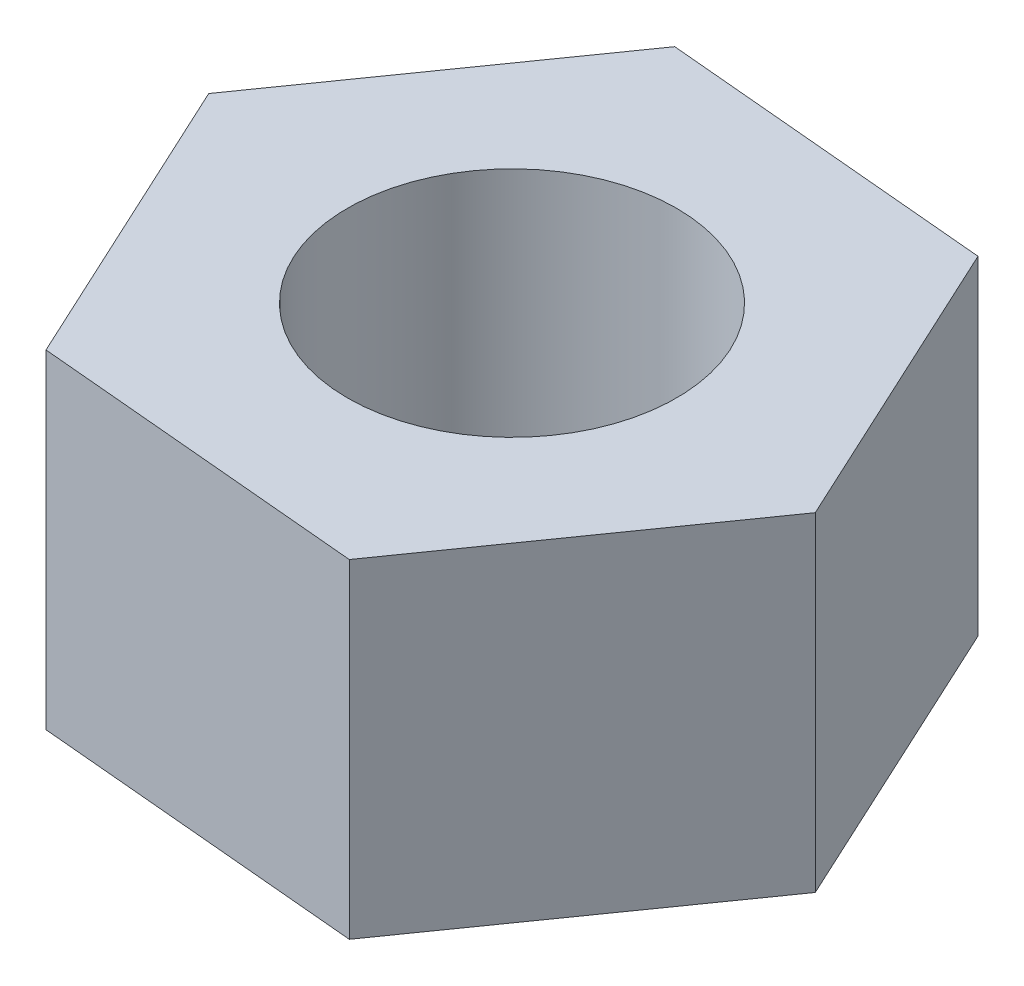
ISO-10303-21;
HEADER;
FILE_DESCRIPTION(('STEP AP214'),'2;1');
FILE_NAME('part.step','',(''),(''),'','','');
FILE_SCHEMA(('AUTOMOTIVE_DESIGN { 1 0 10303 214 1 1 1 1 }'));
ENDSEC;
DATA;
#1=APPLICATION_CONTEXT('core data for automotive mechanical design processes');
#2=APPLICATION_PROTOCOL_DEFINITION('international standard','automotive_design',2000,#1);
#3=PRODUCT_CONTEXT('',#1,'mechanical');
#4=PRODUCT('Part','Part','',(#3));
#5=PRODUCT_RELATED_PRODUCT_CATEGORY('part','',(#4));
#6=PRODUCT_DEFINITION_FORMATION('','',#4);
#7=PRODUCT_DEFINITION_CONTEXT('part definition',#1,'design');
#8=PRODUCT_DEFINITION('design','',#6,#7);
#9=PRODUCT_DEFINITION_SHAPE('','',#8);
#10=(LENGTH_UNIT() NAMED_UNIT(*) SI_UNIT(.MILLI.,.METRE.));
#11=(NAMED_UNIT(*) PLANE_ANGLE_UNIT() SI_UNIT($,.RADIAN.));
#12=(NAMED_UNIT(*) SI_UNIT($,.STERADIAN.) SOLID_ANGLE_UNIT());
#13=UNCERTAINTY_MEASURE_WITH_UNIT(LENGTH_MEASURE(1.E-05),#10,'distance_accuracy_value','');
#14=(GEOMETRIC_REPRESENTATION_CONTEXT(3) GLOBAL_UNCERTAINTY_ASSIGNED_CONTEXT((#13)) GLOBAL_UNIT_ASSIGNED_CONTEXT((#10,
#11,#12)) REPRESENTATION_CONTEXT('',''));
#15=CARTESIAN_POINT('',(0.,0.,0.));
#16=DIRECTION('',(0.,0.,1.));
#17=DIRECTION('',(1.,0.,0.));
#18=AXIS2_PLACEMENT_3D('',#15,#16,#17);
#19=CARTESIAN_POINT('',(0.,4.,0.));
#20=DIRECTION('',(0.,1.,0.));
#21=DIRECTION('',(0.,0.,1.));
#22=AXIS2_PLACEMENT_3D('',#19,#20,#21);
#23=PLANE('',#22);
#24=DIRECTION('',(0.996003754534977,0.,0.0893113707891086));
#25=VECTOR('',#24,1.);
#26=CARTESIAN_POINT('',(-2.34018535864999,4.,3.32678491316549));
#27=LINE('',#26,#25);
#28=CARTESIAN_POINT('',(-2.34018535864999,4.,3.32678491316549));
#29=VERTEX_POINT('',#28);
#30=CARTESIAN_POINT('',(1.71098756840313,4.,3.69005242673803));
#31=VERTEX_POINT('',#30);
#32=EDGE_CURVE('E150',#29,#31,#27,.T.);
#33=ORIENTED_EDGE('',*,*,#32,.T.);
#34=DIRECTION('',(0.575347793217667,0.,-0.817908868297416));
#35=VECTOR('',#34,1.);
#36=CARTESIAN_POINT('',(1.71098756840313,4.,3.69005242673803));
#37=LINE('',#36,#35);
#38=CARTESIAN_POINT('',(4.05117292705312,4.,0.363267513572542));
#39=VERTEX_POINT('',#38);
#40=EDGE_CURVE('E98',#31,#39,#37,.T.);
#41=ORIENTED_EDGE('',*,*,#40,.T.);
#42=DIRECTION('',(-0.420655961317309,0.,-0.907220239086524));
#43=VECTOR('',#42,1.);
#44=CARTESIAN_POINT('',(4.05117292705312,4.,0.363267513572542));
#45=LINE('',#44,#43);
#46=CARTESIAN_POINT('',(2.34018535864999,4.,-3.32678491316549));
#47=VERTEX_POINT('',#46);
#48=EDGE_CURVE('E111',#39,#47,#45,.T.);
#49=ORIENTED_EDGE('',*,*,#48,.T.);
#50=DIRECTION('',(-0.996003754534977,0.,-0.0893113707891089));
#51=VECTOR('',#50,1.);
#52=CARTESIAN_POINT('',(2.34018535864999,4.,-3.32678491316549));
#53=LINE('',#52,#51);
#54=CARTESIAN_POINT('',(-1.71098756840313,4.,-3.69005242673804));
#55=VERTEX_POINT('',#54);
#56=EDGE_CURVE('E105',#47,#55,#53,.T.);
#57=ORIENTED_EDGE('',*,*,#56,.T.);
#58=DIRECTION('',(-0.575347793217668,0.,0.817908868297416));
#59=VECTOR('',#58,1.);
#60=CARTESIAN_POINT('',(-1.71098756840313,4.,-3.69005242673804));
#61=LINE('',#60,#59);
#62=CARTESIAN_POINT('',(-4.05117292705312,4.,-0.363267513572543));
#63=VERTEX_POINT('',#62);
#64=EDGE_CURVE('E109',#55,#63,#61,.T.);
#65=ORIENTED_EDGE('',*,*,#64,.T.);
#66=DIRECTION('',(0.420655961317309,0.,0.907220239086525));
#67=VECTOR('',#66,1.);
#68=CARTESIAN_POINT('',(-4.05117292705312,4.,-0.363267513572543));
#69=LINE('',#68,#67);
#70=EDGE_CURVE('E61',#63,#29,#69,.T.);
#71=ORIENTED_EDGE('',*,*,#70,.T.);
#72=EDGE_LOOP('',(#33,#41,#49,#57,#65,#71));
#73=FACE_BOUND('',#72,.T.);
#74=CARTESIAN_POINT('',(0.,4.,0.));
#75=DIRECTION('',(0.,1.,0.));
#76=DIRECTION('',(0.,0.,1.));
#77=AXIS2_PLACEMENT_3D('',#74,#75,#76);
#78=CIRCLE('',#77,2.);
#79=CARTESIAN_POINT('',(0.,4.,2.));
#80=VERTEX_POINT('',#79);
#81=EDGE_CURVE('E138',#80,#80,#78,.T.);
#82=ORIENTED_EDGE('',*,*,#81,.F.);
#83=EDGE_LOOP('',(#82));
#84=FACE_BOUND('',#83,.T.);
#85=ADVANCED_FACE('F43',(#73,#84),#23,.T.);
#86=CARTESIAN_POINT('',(0.,0.,0.));
#87=DIRECTION('',(0.,1.,0.));
#88=DIRECTION('',(0.,0.,1.));
#89=AXIS2_PLACEMENT_3D('',#86,#87,#88);
#90=PLANE('',#89);
#91=DIRECTION('',(0.996003754534977,0.,0.0893113707891086));
#92=VECTOR('',#91,1.);
#93=CARTESIAN_POINT('',(-2.34018535864999,0.,3.32678491316549));
#94=LINE('',#93,#92);
#95=CARTESIAN_POINT('',(-2.34018535864999,0.,3.32678491316549));
#96=VERTEX_POINT('',#95);
#97=CARTESIAN_POINT('',(1.71098756840313,0.,3.69005242673803));
#98=VERTEX_POINT('',#97);
#99=EDGE_CURVE('E133',#96,#98,#94,.T.);
#100=ORIENTED_EDGE('',*,*,#99,.F.);
#101=DIRECTION('',(0.420655961317309,0.,0.907220239086525));
#102=VECTOR('',#101,1.);
#103=CARTESIAN_POINT('',(-4.05117292705312,0.,-0.363267513572543));
#104=LINE('',#103,#102);
#105=CARTESIAN_POINT('',(-4.05117292705312,0.,-0.363267513572543));
#106=VERTEX_POINT('',#105);
#107=EDGE_CURVE('E90',#106,#96,#104,.T.);
#108=ORIENTED_EDGE('',*,*,#107,.F.);
#109=DIRECTION('',(-0.575347793217668,0.,0.817908868297416));
#110=VECTOR('',#109,1.);
#111=CARTESIAN_POINT('',(-1.71098756840313,0.,-3.69005242673804));
#112=LINE('',#111,#110);
#113=CARTESIAN_POINT('',(-1.71098756840313,0.,-3.69005242673804));
#114=VERTEX_POINT('',#113);
#115=EDGE_CURVE('E84',#114,#106,#112,.T.);
#116=ORIENTED_EDGE('',*,*,#115,.F.);
#117=DIRECTION('',(-0.996003754534977,0.,-0.0893113707891089));
#118=VECTOR('',#117,1.);
#119=CARTESIAN_POINT('',(2.34018535864999,0.,-3.32678491316549));
#120=LINE('',#119,#118);
#121=CARTESIAN_POINT('',(2.34018535864999,0.,-3.32678491316549));
#122=VERTEX_POINT('',#121);
#123=EDGE_CURVE('E120',#122,#114,#120,.T.);
#124=ORIENTED_EDGE('',*,*,#123,.F.);
#125=DIRECTION('',(-0.420655961317309,0.,-0.907220239086524));
#126=VECTOR('',#125,1.);
#127=CARTESIAN_POINT('',(4.05117292705312,0.,0.363267513572542));
#128=LINE('',#127,#126);
#129=CARTESIAN_POINT('',(4.05117292705312,0.,0.363267513572542));
#130=VERTEX_POINT('',#129);
#131=EDGE_CURVE('E141',#130,#122,#128,.T.);
#132=ORIENTED_EDGE('',*,*,#131,.F.);
#133=DIRECTION('',(0.575347793217667,0.,-0.817908868297416));
#134=VECTOR('',#133,1.);
#135=CARTESIAN_POINT('',(1.71098756840313,0.,3.69005242673803));
#136=LINE('',#135,#134);
#137=EDGE_CURVE('E137',#98,#130,#136,.T.);
#138=ORIENTED_EDGE('',*,*,#137,.F.);
#139=EDGE_LOOP('',(#100,#108,#116,#124,#132,#138));
#140=FACE_BOUND('',#139,.T.);
#141=CARTESIAN_POINT('',(0.,0.,0.));
#142=DIRECTION('',(0.,1.,0.));
#143=DIRECTION('',(0.,0.,1.));
#144=AXIS2_PLACEMENT_3D('',#141,#142,#143);
#145=CIRCLE('',#144,2.);
#146=CARTESIAN_POINT('',(0.,0.,2.));
#147=VERTEX_POINT('',#146);
#148=EDGE_CURVE('E265',#147,#147,#145,.T.);
#149=ORIENTED_EDGE('',*,*,#148,.T.);
#150=EDGE_LOOP('',(#149));
#151=FACE_BOUND('',#150,.T.);
#152=ADVANCED_FACE('F163',(#140,#151),#90,.F.);
#153=CARTESIAN_POINT('',(-2.34018535864999,4.,3.32678491316549));
#154=DIRECTION('',(0.0893113707891086,0.,-0.996003754534977));
#155=DIRECTION('',(-0.996003754534977,0.,-0.0893113707891086));
#156=AXIS2_PLACEMENT_3D('',#153,#154,#155);
#157=PLANE('',#156);
#158=ORIENTED_EDGE('',*,*,#99,.T.);
#159=DIRECTION('',(0.,-1.,0.));
#160=VECTOR('',#159,1.);
#161=CARTESIAN_POINT('',(1.71098756840313,4.,3.69005242673803));
#162=LINE('',#161,#160);
#163=EDGE_CURVE('E11',#31,#98,#162,.T.);
#164=ORIENTED_EDGE('',*,*,#163,.F.);
#165=ORIENTED_EDGE('',*,*,#32,.F.);
#166=DIRECTION('',(0.,-1.,0.));
#167=VECTOR('',#166,1.);
#168=CARTESIAN_POINT('',(-2.34018535864999,4.,3.32678491316549));
#169=LINE('',#168,#167);
#170=EDGE_CURVE('E129',#29,#96,#169,.T.);
#171=ORIENTED_EDGE('',*,*,#170,.T.);
#172=EDGE_LOOP('',(#158,#164,#165,#171));
#173=FACE_BOUND('',#172,.T.);
#174=ADVANCED_FACE('F45',(#173),#157,.F.);
#175=CARTESIAN_POINT('',(1.71098756840313,4.,3.69005242673803));
#176=DIRECTION('',(-0.817908868297416,0.,-0.575347793217667));
#177=DIRECTION('',(-0.575347793217667,0.,0.817908868297416));
#178=AXIS2_PLACEMENT_3D('',#175,#176,#177);
#179=PLANE('',#178);
#180=ORIENTED_EDGE('',*,*,#137,.T.);
#181=DIRECTION('',(0.,-1.,0.));
#182=VECTOR('',#181,1.);
#183=CARTESIAN_POINT('',(4.05117292705312,4.,0.363267513572542));
#184=LINE('',#183,#182);
#185=EDGE_CURVE('E53',#39,#130,#184,.T.);
#186=ORIENTED_EDGE('',*,*,#185,.F.);
#187=ORIENTED_EDGE('',*,*,#40,.F.);
#188=ORIENTED_EDGE('',*,*,#163,.T.);
#189=EDGE_LOOP('',(#180,#186,#187,#188));
#190=FACE_BOUND('',#189,.T.);
#191=ADVANCED_FACE('F188',(#190),#179,.F.);
#192=CARTESIAN_POINT('',(4.05117292705312,4.,0.363267513572542));
#193=DIRECTION('',(-0.907220239086525,0.,0.420655961317309));
#194=DIRECTION('',(0.420655961317309,0.,0.907220239086524));
#195=AXIS2_PLACEMENT_3D('',#192,#193,#194);
#196=PLANE('',#195);
#197=ORIENTED_EDGE('',*,*,#131,.T.);
#198=DIRECTION('',(0.,-1.,0.));
#199=VECTOR('',#198,1.);
#200=CARTESIAN_POINT('',(2.34018535864999,4.,-3.32678491316549));
#201=LINE('',#200,#199);
#202=EDGE_CURVE('E122',#47,#122,#201,.T.);
#203=ORIENTED_EDGE('',*,*,#202,.F.);
#204=ORIENTED_EDGE('',*,*,#48,.F.);
#205=ORIENTED_EDGE('',*,*,#185,.T.);
#206=EDGE_LOOP('',(#197,#203,#204,#205));
#207=FACE_BOUND('',#206,.T.);
#208=ADVANCED_FACE('F160',(#207),#196,.F.);
#209=CARTESIAN_POINT('',(2.34018535864999,4.,-3.32678491316549));
#210=DIRECTION('',(-0.0893113707891089,0.,0.996003754534977));
#211=DIRECTION('',(0.996003754534977,0.,0.0893113707891089));
#212=AXIS2_PLACEMENT_3D('',#209,#210,#211);
#213=PLANE('',#212);
#214=ORIENTED_EDGE('',*,*,#123,.T.);
#215=DIRECTION('',(0.,-1.,0.));
#216=VECTOR('',#215,1.);
#217=CARTESIAN_POINT('',(-1.71098756840313,4.,-3.69005242673804));
#218=LINE('',#217,#216);
#219=EDGE_CURVE('E117',#55,#114,#218,.T.);
#220=ORIENTED_EDGE('',*,*,#219,.F.);
#221=ORIENTED_EDGE('',*,*,#56,.F.);
#222=ORIENTED_EDGE('',*,*,#202,.T.);
#223=EDGE_LOOP('',(#214,#220,#221,#222));
#224=FACE_BOUND('',#223,.T.);
#225=ADVANCED_FACE('F118',(#224),#213,.F.);
#226=CARTESIAN_POINT('',(-1.71098756840313,4.,-3.69005242673804));
#227=DIRECTION('',(0.817908868297416,0.,0.575347793217668));
#228=DIRECTION('',(0.575347793217668,0.,-0.817908868297416));
#229=AXIS2_PLACEMENT_3D('',#226,#227,#228);
#230=PLANE('',#229);
#231=ORIENTED_EDGE('',*,*,#115,.T.);
#232=DIRECTION('',(0.,-1.,0.));
#233=VECTOR('',#232,1.);
#234=CARTESIAN_POINT('',(-4.05117292705312,4.,-0.363267513572543));
#235=LINE('',#234,#233);
#236=EDGE_CURVE('E123',#63,#106,#235,.T.);
#237=ORIENTED_EDGE('',*,*,#236,.F.);
#238=ORIENTED_EDGE('',*,*,#64,.F.);
#239=ORIENTED_EDGE('',*,*,#219,.T.);
#240=EDGE_LOOP('',(#231,#237,#238,#239));
#241=FACE_BOUND('',#240,.T.);
#242=ADVANCED_FACE('F125',(#241),#230,.F.);
#243=CARTESIAN_POINT('',(-4.05117292705312,4.,-0.363267513572543));
#244=DIRECTION('',(0.907220239086525,0.,-0.420655961317309));
#245=DIRECTION('',(-0.420655961317309,0.,-0.907220239086525));
#246=AXIS2_PLACEMENT_3D('',#243,#244,#245);
#247=PLANE('',#246);
#248=ORIENTED_EDGE('',*,*,#107,.T.);
#249=ORIENTED_EDGE('',*,*,#170,.F.);
#250=ORIENTED_EDGE('',*,*,#70,.F.);
#251=ORIENTED_EDGE('',*,*,#236,.T.);
#252=EDGE_LOOP('',(#248,#249,#250,#251));
#253=FACE_BOUND('',#252,.T.);
#254=ADVANCED_FACE('F168',(#253),#247,.F.);
#255=CARTESIAN_POINT('',(0.,4.,0.));
#256=DIRECTION('',(0.,-1.,0.));
#257=DIRECTION('',(0.,0.,-1.));
#258=AXIS2_PLACEMENT_3D('',#255,#256,#257);
#259=CYLINDRICAL_SURFACE('',#258,2.);
#260=ORIENTED_EDGE('',*,*,#81,.T.);
#261=EDGE_LOOP('',(#260));
#262=FACE_BOUND('',#261,.T.);
#263=ORIENTED_EDGE('',*,*,#148,.F.);
#264=EDGE_LOOP('',(#263));
#265=FACE_BOUND('',#264,.T.);
#266=ADVANCED_FACE('F170',(#262,#265),#259,.F.);
#267=CLOSED_SHELL('',(#85,#152,#174,#191,#208,#225,#242,#254,#266));
#268=MANIFOLD_SOLID_BREP('B2',#267);
#269=ADVANCED_BREP_SHAPE_REPRESENTATION('',(#18,#268),#14);
#270=SHAPE_DEFINITION_REPRESENTATION(#9,#269);
ENDSEC;
END-ISO-10303-21;
